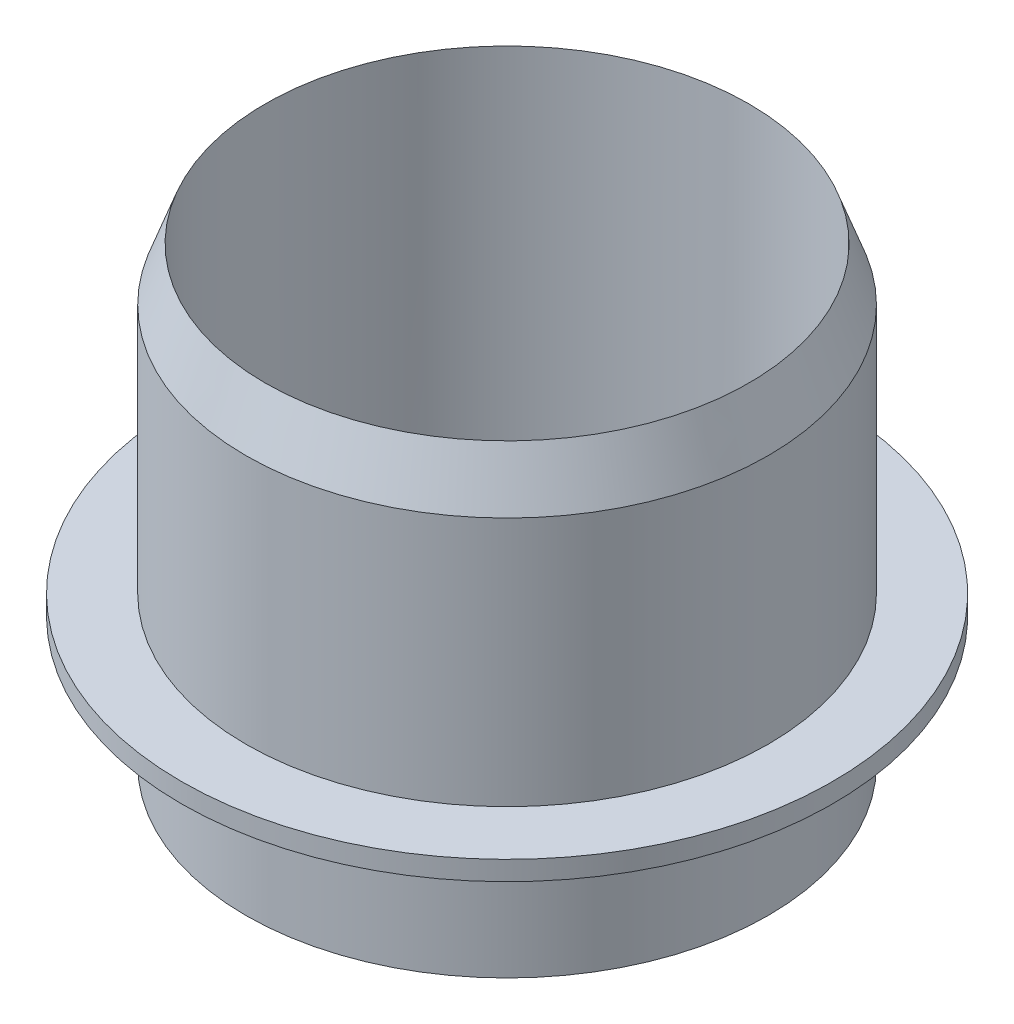
ISO-10303-21;
HEADER;
FILE_DESCRIPTION(('STEP AP214'),'2;1');
FILE_NAME('part.step','',(''),(''),'','','');
FILE_SCHEMA(('AUTOMOTIVE_DESIGN { 1 0 10303 214 1 1 1 1 }'));
ENDSEC;
DATA;
#1=APPLICATION_CONTEXT('core data for automotive mechanical design processes');
#2=APPLICATION_PROTOCOL_DEFINITION('international standard','automotive_design',2000,#1);
#3=PRODUCT_CONTEXT('',#1,'mechanical');
#4=PRODUCT('Part','Part','',(#3));
#5=PRODUCT_RELATED_PRODUCT_CATEGORY('part','',(#4));
#6=PRODUCT_DEFINITION_FORMATION('','',#4);
#7=PRODUCT_DEFINITION_CONTEXT('part definition',#1,'design');
#8=PRODUCT_DEFINITION('design','',#6,#7);
#9=PRODUCT_DEFINITION_SHAPE('','',#8);
#10=(LENGTH_UNIT() NAMED_UNIT(*) SI_UNIT(.MILLI.,.METRE.));
#11=(NAMED_UNIT(*) PLANE_ANGLE_UNIT() SI_UNIT($,.RADIAN.));
#12=(NAMED_UNIT(*) SI_UNIT($,.STERADIAN.) SOLID_ANGLE_UNIT());
#13=UNCERTAINTY_MEASURE_WITH_UNIT(LENGTH_MEASURE(1.E-05),#10,'distance_accuracy_value','');
#14=(GEOMETRIC_REPRESENTATION_CONTEXT(3) GLOBAL_UNCERTAINTY_ASSIGNED_CONTEXT((#13)) GLOBAL_UNIT_ASSIGNED_CONTEXT((#10,
#11,#12)) REPRESENTATION_CONTEXT('',''));
#15=CARTESIAN_POINT('',(0.,0.,0.));
#16=DIRECTION('',(0.,0.,1.));
#17=DIRECTION('',(1.,0.,0.));
#18=AXIS2_PLACEMENT_3D('',#15,#16,#17);
#19=CARTESIAN_POINT('',(0.,70.,0.));
#20=DIRECTION('',(0.,-1.,0.));
#21=DIRECTION('',(0.,0.,-1.));
#22=AXIS2_PLACEMENT_3D('',#19,#20,#21);
#23=CYLINDRICAL_SURFACE('',#22,40.5);
#24=CARTESIAN_POINT('',(0.,0.,0.));
#25=DIRECTION('',(0.,1.,0.));
#26=DIRECTION('',(1.,0.,0.));
#27=AXIS2_PLACEMENT_3D('',#24,#25,#26);
#28=CIRCLE('',#27,40.5);
#29=CARTESIAN_POINT('',(40.5,0.,0.));
#30=VERTEX_POINT('',#29);
#31=EDGE_CURVE('E46',#30,#30,#28,.T.);
#32=ORIENTED_EDGE('',*,*,#31,.T.);
#33=EDGE_LOOP('',(#32));
#34=FACE_BOUND('',#33,.T.);
#35=CARTESIAN_POINT('',(0.,20.,0.));
#36=DIRECTION('',(0.,1.,0.));
#37=DIRECTION('',(0.,0.,1.));
#38=AXIS2_PLACEMENT_3D('',#35,#36,#37);
#39=CIRCLE('',#38,40.5);
#40=CARTESIAN_POINT('',(0.,20.,40.5));
#41=VERTEX_POINT('',#40);
#42=EDGE_CURVE('E11',#41,#41,#39,.T.);
#43=ORIENTED_EDGE('',*,*,#42,.F.);
#44=EDGE_LOOP('',(#43));
#45=FACE_BOUND('',#44,.T.);
#46=ADVANCED_FACE('F39',(#34,#45),#23,.T.);
#47=CARTESIAN_POINT('',(0.,23.,0.));
#48=DIRECTION('',(0.,1.,0.));
#49=DIRECTION('',(0.,0.,1.));
#50=AXIS2_PLACEMENT_3D('',#47,#48,#49);
#51=CIRCLE('',#50,40.5);
#52=CARTESIAN_POINT('',(0.,23.,40.5));
#53=VERTEX_POINT('',#52);
#54=EDGE_CURVE('E66',#53,#53,#51,.T.);
#55=ORIENTED_EDGE('',*,*,#54,.T.);
#56=EDGE_LOOP('',(#55));
#57=FACE_BOUND('',#56,.T.);
#58=CARTESIAN_POINT('',(0.,61.7575677416361,0.));
#59=DIRECTION('',(0.,-1.,0.));
#60=DIRECTION('',(0.,0.,-1.));
#61=AXIS2_PLACEMENT_3D('',#58,#59,#60);
#62=CIRCLE('',#61,40.5);
#63=CARTESIAN_POINT('',(0.,61.7575677416361,-40.5));
#64=VERTEX_POINT('',#63);
#65=EDGE_CURVE('E54',#64,#64,#62,.F.);
#66=ORIENTED_EDGE('',*,*,#65,.F.);
#67=EDGE_LOOP('',(#66));
#68=FACE_BOUND('',#67,.T.);
#69=ADVANCED_FACE('F41',(#57,#68),#23,.T.);
#70=CARTESIAN_POINT('',(0.,0.,0.));
#71=DIRECTION('',(0.,1.,0.));
#72=DIRECTION('',(0.,0.,1.));
#73=AXIS2_PLACEMENT_3D('',#70,#71,#72);
#74=PLANE('',#73);
#75=ORIENTED_EDGE('',*,*,#31,.F.);
#76=EDGE_LOOP('',(#75));
#77=FACE_BOUND('',#76,.T.);
#78=CARTESIAN_POINT('',(0.,0.,0.));
#79=DIRECTION('',(0.,1.,0.));
#80=DIRECTION('',(0.,0.,1.));
#81=AXIS2_PLACEMENT_3D('',#78,#79,#80);
#82=CIRCLE('',#81,37.5);
#83=CARTESIAN_POINT('',(0.,0.,37.5));
#84=VERTEX_POINT('',#83);
#85=EDGE_CURVE('E50',#84,#84,#82,.T.);
#86=ORIENTED_EDGE('',*,*,#85,.T.);
#87=EDGE_LOOP('',(#86));
#88=FACE_BOUND('',#87,.T.);
#89=ADVANCED_FACE('F96',(#77,#88),#74,.F.);
#90=CARTESIAN_POINT('',(0.,70.,0.));
#91=DIRECTION('',(0.,-1.,0.));
#92=DIRECTION('',(0.,0.,-1.));
#93=AXIS2_PLACEMENT_3D('',#90,#91,#92);
#94=CYLINDRICAL_SURFACE('',#93,37.5);
#95=CARTESIAN_POINT('',(0.,70.,0.));
#96=DIRECTION('',(0.,1.,0.));
#97=DIRECTION('',(0.,0.,1.));
#98=AXIS2_PLACEMENT_3D('',#95,#96,#97);
#99=CIRCLE('',#98,37.5);
#100=CARTESIAN_POINT('',(0.,70.,37.5));
#101=VERTEX_POINT('',#100);
#102=EDGE_CURVE('E59',#101,#101,#99,.T.);
#103=ORIENTED_EDGE('',*,*,#102,.T.);
#104=EDGE_LOOP('',(#103));
#105=FACE_BOUND('',#104,.T.);
#106=ORIENTED_EDGE('',*,*,#85,.F.);
#107=EDGE_LOOP('',(#106));
#108=FACE_BOUND('',#107,.T.);
#109=ADVANCED_FACE('F88',(#105,#108),#94,.F.);
#110=CARTESIAN_POINT('',(0.,70.,0.));
#111=DIRECTION('',(0.,-1.,0.));
#112=DIRECTION('',(0.,0.,-1.));
#113=AXIS2_PLACEMENT_3D('',#110,#111,#112);
#114=CONICAL_SURFACE('',#113,37.5,0.349065850398863);
#115=ORIENTED_EDGE('',*,*,#102,.F.);
#116=EDGE_LOOP('',(#115));
#117=FACE_BOUND('',#116,.T.);
#118=ORIENTED_EDGE('',*,*,#65,.T.);
#119=EDGE_LOOP('',(#118));
#120=FACE_BOUND('',#119,.T.);
#121=ADVANCED_FACE('F77',(#117,#120),#114,.T.);
#122=CARTESIAN_POINT('',(0.,23.,0.));
#123=DIRECTION('',(0.,1.,0.));
#124=DIRECTION('',(0.,0.,1.));
#125=AXIS2_PLACEMENT_3D('',#122,#123,#124);
#126=PLANE('',#125);
#127=CARTESIAN_POINT('',(0.,23.,0.));
#128=DIRECTION('',(0.,1.,0.));
#129=DIRECTION('',(0.,0.,1.));
#130=AXIS2_PLACEMENT_3D('',#127,#128,#129);
#131=CIRCLE('',#130,50.5);
#132=CARTESIAN_POINT('',(0.,23.,50.5));
#133=VERTEX_POINT('',#132);
#134=EDGE_CURVE('E62',#133,#133,#131,.T.);
#135=ORIENTED_EDGE('',*,*,#134,.T.);
#136=EDGE_LOOP('',(#135));
#137=FACE_BOUND('',#136,.T.);
#138=ORIENTED_EDGE('',*,*,#54,.F.);
#139=EDGE_LOOP('',(#138));
#140=FACE_BOUND('',#139,.T.);
#141=ADVANCED_FACE('F74',(#137,#140),#126,.T.);
#142=CARTESIAN_POINT('',(0.,20.,0.));
#143=DIRECTION('',(0.,1.,0.));
#144=DIRECTION('',(0.,0.,1.));
#145=AXIS2_PLACEMENT_3D('',#142,#143,#144);
#146=PLANE('',#145);
#147=CARTESIAN_POINT('',(0.,20.,0.));
#148=DIRECTION('',(0.,1.,0.));
#149=DIRECTION('',(0.,0.,1.));
#150=AXIS2_PLACEMENT_3D('',#147,#148,#149);
#151=CIRCLE('',#150,50.5);
#152=CARTESIAN_POINT('',(0.,20.,50.5));
#153=VERTEX_POINT('',#152);
#154=EDGE_CURVE('E63',#153,#153,#151,.T.);
#155=ORIENTED_EDGE('',*,*,#154,.F.);
#156=EDGE_LOOP('',(#155));
#157=FACE_BOUND('',#156,.T.);
#158=ORIENTED_EDGE('',*,*,#42,.T.);
#159=EDGE_LOOP('',(#158));
#160=FACE_BOUND('',#159,.T.);
#161=ADVANCED_FACE('F76',(#157,#160),#146,.F.);
#162=CARTESIAN_POINT('',(0.,23.,0.));
#163=DIRECTION('',(0.,-1.,0.));
#164=DIRECTION('',(0.,0.,-1.));
#165=AXIS2_PLACEMENT_3D('',#162,#163,#164);
#166=CYLINDRICAL_SURFACE('',#165,50.5);
#167=ORIENTED_EDGE('',*,*,#134,.F.);
#168=EDGE_LOOP('',(#167));
#169=FACE_BOUND('',#168,.T.);
#170=ORIENTED_EDGE('',*,*,#154,.T.);
#171=EDGE_LOOP('',(#170));
#172=FACE_BOUND('',#171,.T.);
#173=ADVANCED_FACE('F84',(#169,#172),#166,.T.);
#174=CLOSED_SHELL('',(#46,#69,#89,#109,#121,#141,#161,#173));
#175=MANIFOLD_SOLID_BREP('B2',#174);
#176=ADVANCED_BREP_SHAPE_REPRESENTATION('',(#18,#175),#14);
#177=SHAPE_DEFINITION_REPRESENTATION(#9,#176);
ENDSEC;
END-ISO-10303-21;
